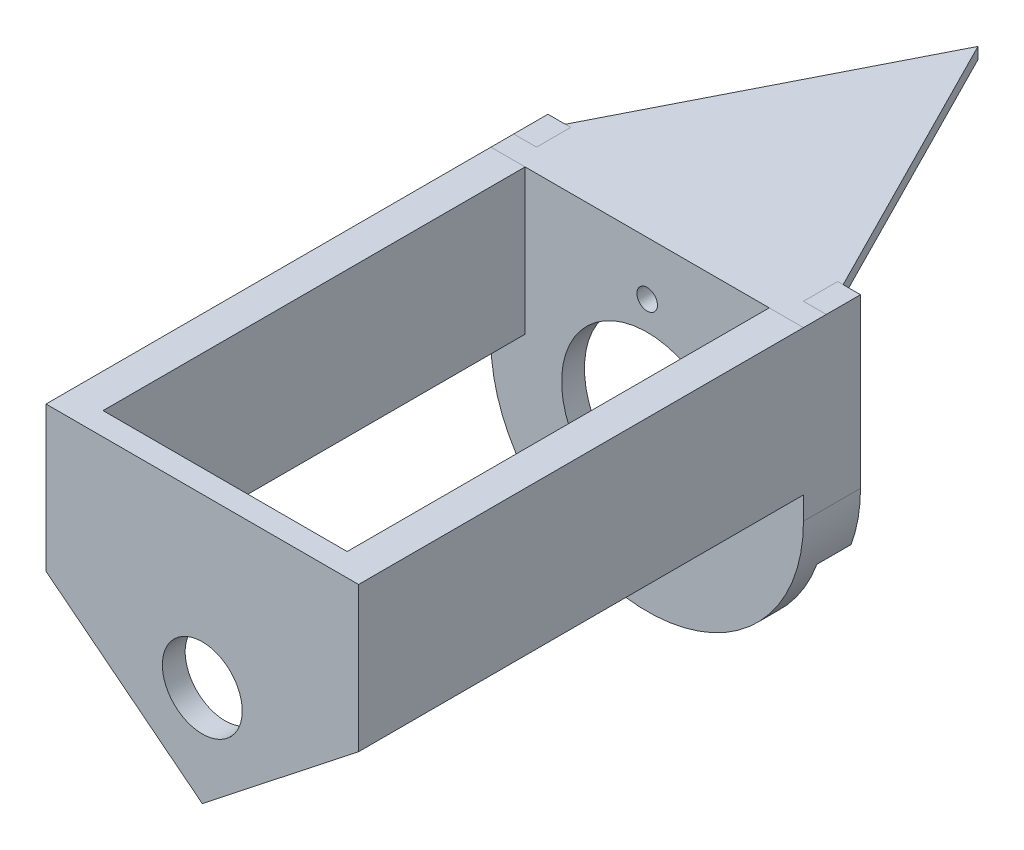
ISO-10303-21;
HEADER;
FILE_DESCRIPTION(('STEP AP214'),'2;1');
FILE_NAME('part.step','',(''),(''),'','','');
FILE_SCHEMA(('AUTOMOTIVE_DESIGN { 1 0 10303 214 1 1 1 1 }'));
ENDSEC;
DATA;
#1=APPLICATION_CONTEXT('core data for automotive mechanical design processes');
#2=APPLICATION_PROTOCOL_DEFINITION('international standard','automotive_design',2000,#1);
#3=PRODUCT_CONTEXT('',#1,'mechanical');
#4=PRODUCT('Part','Part','',(#3));
#5=PRODUCT_RELATED_PRODUCT_CATEGORY('part','',(#4));
#6=PRODUCT_DEFINITION_FORMATION('','',#4);
#7=PRODUCT_DEFINITION_CONTEXT('part definition',#1,'design');
#8=PRODUCT_DEFINITION('design','',#6,#7);
#9=PRODUCT_DEFINITION_SHAPE('','',#8);
#10=(LENGTH_UNIT() NAMED_UNIT(*) SI_UNIT(.MILLI.,.METRE.));
#11=(NAMED_UNIT(*) PLANE_ANGLE_UNIT() SI_UNIT($,.RADIAN.));
#12=(NAMED_UNIT(*) SI_UNIT($,.STERADIAN.) SOLID_ANGLE_UNIT());
#13=UNCERTAINTY_MEASURE_WITH_UNIT(LENGTH_MEASURE(1.E-05),#10,'distance_accuracy_value','');
#14=(GEOMETRIC_REPRESENTATION_CONTEXT(3) GLOBAL_UNCERTAINTY_ASSIGNED_CONTEXT((#13)) GLOBAL_UNIT_ASSIGNED_CONTEXT((#10,
#11,#12)) REPRESENTATION_CONTEXT('',''));
#15=CARTESIAN_POINT('',(0.,0.,0.));
#16=DIRECTION('',(0.,0.,1.));
#17=DIRECTION('',(1.,0.,0.));
#18=AXIS2_PLACEMENT_3D('',#15,#16,#17);
#19=CARTESIAN_POINT('',(0.,0.,0.));
#20=DIRECTION('',(0.,0.,1.));
#21=DIRECTION('',(1.,0.,0.));
#22=AXIS2_PLACEMENT_3D('',#19,#20,#21);
#23=PLANE('',#22);
#24=CARTESIAN_POINT('',(0.,-10.,0.));
#25=DIRECTION('',(0.,0.,1.));
#26=DIRECTION('',(1.,0.,0.));
#27=AXIS2_PLACEMENT_3D('',#24,#25,#26);
#28=CIRCLE('',#27,0.9);
#29=CARTESIAN_POINT('',(0.9,-10.,0.));
#30=VERTEX_POINT('',#29);
#31=EDGE_CURVE('E349',#30,#30,#28,.F.);
#32=ORIENTED_EDGE('',*,*,#31,.F.);
#33=EDGE_LOOP('',(#32));
#34=FACE_BOUND('',#33,.T.);
#35=CARTESIAN_POINT('',(0.,10.,0.));
#36=DIRECTION('',(0.,0.,1.));
#37=DIRECTION('',(1.,0.,0.));
#38=AXIS2_PLACEMENT_3D('',#35,#36,#37);
#39=CIRCLE('',#38,0.9);
#40=CARTESIAN_POINT('',(0.9,10.,0.));
#41=VERTEX_POINT('',#40);
#42=EDGE_CURVE('E358',#41,#41,#39,.F.);
#43=ORIENTED_EDGE('',*,*,#42,.F.);
#44=EDGE_LOOP('',(#43));
#45=FACE_BOUND('',#44,.T.);
#46=CARTESIAN_POINT('',(0.,0.,0.));
#47=DIRECTION('',(0.,0.,1.));
#48=DIRECTION('',(1.,0.,0.));
#49=AXIS2_PLACEMENT_3D('',#46,#47,#48);
#50=CIRCLE('',#49,7.5);
#51=CARTESIAN_POINT('',(7.5,0.,0.));
#52=VERTEX_POINT('',#51);
#53=EDGE_CURVE('E432',#52,#52,#50,.F.);
#54=ORIENTED_EDGE('',*,*,#53,.F.);
#55=EDGE_LOOP('',(#54));
#56=FACE_BOUND('',#55,.T.);
#57=DIRECTION('',(0.,-1.,0.));
#58=VECTOR('',#57,1.);
#59=CARTESIAN_POINT('',(-11.7,14.700025,0.));
#60=LINE('',#59,#58);
#61=CARTESIAN_POINT('',(-11.7,13.7,0.));
#62=VERTEX_POINT('',#61);
#63=CARTESIAN_POINT('',(-11.7,0.,0.));
#64=VERTEX_POINT('',#63);
#65=EDGE_CURVE('E272',#62,#64,#60,.T.);
#66=ORIENTED_EDGE('',*,*,#65,.F.);
#67=DIRECTION('',(1.,0.,0.));
#68=VECTOR('',#67,1.);
#69=CARTESIAN_POINT('',(0.,13.7,0.));
#70=LINE('',#69,#68);
#71=CARTESIAN_POINT('',(11.7,13.7,0.));
#72=VERTEX_POINT('',#71);
#73=EDGE_CURVE('E475',#62,#72,#70,.T.);
#74=ORIENTED_EDGE('',*,*,#73,.T.);
#75=DIRECTION('',(0.,-1.,0.));
#76=VECTOR('',#75,1.);
#77=CARTESIAN_POINT('',(11.7,14.700025,0.));
#78=LINE('',#77,#76);
#79=CARTESIAN_POINT('',(11.7,0.,0.));
#80=VERTEX_POINT('',#79);
#81=EDGE_CURVE('E302',#72,#80,#78,.T.);
#82=ORIENTED_EDGE('',*,*,#81,.T.);
#83=CARTESIAN_POINT('',(0.,0.,0.));
#84=DIRECTION('',(0.,0.,-1.));
#85=DIRECTION('',(-1.,0.,0.));
#86=AXIS2_PLACEMENT_3D('',#83,#84,#85);
#87=CIRCLE('',#86,11.7);
#88=CARTESIAN_POINT('',(10.9944036631951,-4.00163567691034,0.));
#89=VERTEX_POINT('',#88);
#90=EDGE_CURVE('E458',#80,#89,#87,.T.);
#91=ORIENTED_EDGE('',*,*,#90,.T.);
#92=DIRECTION('',(-0.939692620785908,0.34202014332567,0.));
#93=VECTOR('',#92,1.);
#94=CARTESIAN_POINT('',(0.,0.,0.));
#95=LINE('',#94,#93);
#96=CARTESIAN_POINT('',(12.8737889047669,-4.68567596356168,0.));
#97=VERTEX_POINT('',#96);
#98=EDGE_CURVE('E454',#97,#89,#95,.T.);
#99=ORIENTED_EDGE('',*,*,#98,.F.);
#100=CARTESIAN_POINT('',(0.,0.,0.));
#101=DIRECTION('',(0.,0.,1.));
#102=DIRECTION('',(1.,0.,0.));
#103=AXIS2_PLACEMENT_3D('',#100,#101,#102);
#104=CIRCLE('',#103,13.7);
#105=CARTESIAN_POINT('',(-12.8737889047669,-4.68567596356167,0.));
#106=VERTEX_POINT('',#105);
#107=EDGE_CURVE('E486',#106,#97,#104,.T.);
#108=ORIENTED_EDGE('',*,*,#107,.F.);
#109=DIRECTION('',(-0.939692620785908,-0.342020143325669,0.));
#110=VECTOR('',#109,1.);
#111=CARTESIAN_POINT('',(0.,0.,0.));
#112=LINE('',#111,#110);
#113=CARTESIAN_POINT('',(-10.9944036631951,-4.00163567691033,0.));
#114=VERTEX_POINT('',#113);
#115=EDGE_CURVE('E439',#114,#106,#112,.T.);
#116=ORIENTED_EDGE('',*,*,#115,.F.);
#117=CARTESIAN_POINT('',(0.,0.,0.));
#118=DIRECTION('',(0.,0.,-1.));
#119=DIRECTION('',(-1.,0.,0.));
#120=AXIS2_PLACEMENT_3D('',#117,#118,#119);
#121=CIRCLE('',#120,11.7);
#122=EDGE_CURVE('E435',#114,#64,#121,.T.);
#123=ORIENTED_EDGE('',*,*,#122,.T.);
#124=EDGE_LOOP('',(#66,#74,#82,#91,#99,#108,#116,#123));
#125=FACE_BOUND('',#124,.T.);
#126=ADVANCED_FACE('F35',(#34,#45,#56,#125),#23,.F.);
#127=CARTESIAN_POINT('',(0.,14.7,0.));
#128=DIRECTION('',(0.,1.,0.));
#129=DIRECTION('',(0.,0.,1.));
#130=AXIS2_PLACEMENT_3D('',#127,#128,#129);
#131=PLANE('',#130);
#132=DIRECTION('',(0.,0.,1.));
#133=VECTOR('',#132,1.);
#134=CARTESIAN_POINT('',(-11.7,14.7,0.));
#135=LINE('',#134,#133);
#136=CARTESIAN_POINT('',(-11.7,14.7,-3.));
#137=VERTEX_POINT('',#136);
#138=CARTESIAN_POINT('',(-11.7,14.7,0.));
#139=VERTEX_POINT('',#138);
#140=EDGE_CURVE('E50',#137,#139,#135,.T.);
#141=ORIENTED_EDGE('',*,*,#140,.T.);
#142=DIRECTION('',(-1.,0.,0.));
#143=VECTOR('',#142,1.);
#144=CARTESIAN_POINT('',(0.,14.7,0.));
#145=LINE('',#144,#143);
#146=CARTESIAN_POINT('',(-13.7,14.7,0.));
#147=VERTEX_POINT('',#146);
#148=EDGE_CURVE('E277',#139,#147,#145,.T.);
#149=ORIENTED_EDGE('',*,*,#148,.T.);
#150=DIRECTION('',(0.,0.,1.));
#151=VECTOR('',#150,1.);
#152=CARTESIAN_POINT('',(-13.7,14.7,0.));
#153=LINE('',#152,#151);
#154=CARTESIAN_POINT('',(-13.7,14.7,2.));
#155=VERTEX_POINT('',#154);
#156=EDGE_CURVE('E267',#147,#155,#153,.T.);
#157=ORIENTED_EDGE('',*,*,#156,.T.);
#158=DIRECTION('',(1.,0.,0.));
#159=VECTOR('',#158,1.);
#160=CARTESIAN_POINT('',(0.,14.7,2.));
#161=LINE('',#160,#159);
#162=CARTESIAN_POINT('',(-10.7,14.7,2.));
#163=VERTEX_POINT('',#162);
#164=EDGE_CURVE('E417',#155,#163,#161,.T.);
#165=ORIENTED_EDGE('',*,*,#164,.T.);
#166=CARTESIAN_POINT('',(10.7,14.7,2.));
#167=VERTEX_POINT('',#166);
#168=EDGE_CURVE('E416',#163,#167,#161,.T.);
#169=ORIENTED_EDGE('',*,*,#168,.T.);
#170=DIRECTION('',(1.,0.,0.));
#171=VECTOR('',#170,1.);
#172=CARTESIAN_POINT('',(0.,14.7,2.));
#173=LINE('',#172,#171);
#174=CARTESIAN_POINT('',(13.7,14.7,2.));
#175=VERTEX_POINT('',#174);
#176=EDGE_CURVE('E346',#167,#175,#173,.T.);
#177=ORIENTED_EDGE('',*,*,#176,.T.);
#178=DIRECTION('',(0.,0.,-1.));
#179=VECTOR('',#178,1.);
#180=CARTESIAN_POINT('',(13.7,14.7,0.));
#181=LINE('',#180,#179);
#182=CARTESIAN_POINT('',(13.7,14.7,0.));
#183=VERTEX_POINT('',#182);
#184=EDGE_CURVE('E420',#175,#183,#181,.T.);
#185=ORIENTED_EDGE('',*,*,#184,.T.);
#186=DIRECTION('',(-1.,0.,0.));
#187=VECTOR('',#186,1.);
#188=CARTESIAN_POINT('',(0.,14.7,0.));
#189=LINE('',#188,#187);
#190=CARTESIAN_POINT('',(11.7,14.7,0.));
#191=VERTEX_POINT('',#190);
#192=EDGE_CURVE('E311',#183,#191,#189,.T.);
#193=ORIENTED_EDGE('',*,*,#192,.T.);
#194=DIRECTION('',(0.,0.,-1.));
#195=VECTOR('',#194,1.);
#196=CARTESIAN_POINT('',(11.7,14.7,0.));
#197=LINE('',#196,#195);
#198=CARTESIAN_POINT('',(11.7,14.7,-3.));
#199=VERTEX_POINT('',#198);
#200=EDGE_CURVE('E313',#191,#199,#197,.T.);
#201=ORIENTED_EDGE('',*,*,#200,.T.);
#202=DIRECTION('',(1.,0.,0.));
#203=VECTOR('',#202,1.);
#204=CARTESIAN_POINT('',(0.,14.7,-3.));
#205=LINE('',#204,#203);
#206=CARTESIAN_POINT('',(12.1777777777778,14.7,-3.));
#207=VERTEX_POINT('',#206);
#208=EDGE_CURVE('E309',#199,#207,#205,.T.);
#209=ORIENTED_EDGE('',*,*,#208,.T.);
#210=DIRECTION('',(-0.45249034853551,0.,-0.891769300033486));
#211=VECTOR('',#210,1.);
#212=CARTESIAN_POINT('',(10.8949590374063,14.7,-5.52818291898024));
#213=LINE('',#212,#211);
#214=CARTESIAN_POINT('',(0.,14.7,-27.));
#215=VERTEX_POINT('',#214);
#216=EDGE_CURVE('E422',#207,#215,#213,.T.);
#217=ORIENTED_EDGE('',*,*,#216,.T.);
#218=DIRECTION('',(-0.45249034853551,0.,0.891769300033486));
#219=VECTOR('',#218,1.);
#220=CARTESIAN_POINT('',(-10.8949590374063,14.7,-5.52818291898024));
#221=LINE('',#220,#219);
#222=CARTESIAN_POINT('',(-12.1777777777778,14.7,-3.));
#223=VERTEX_POINT('',#222);
#224=EDGE_CURVE('E412',#215,#223,#221,.T.);
#225=ORIENTED_EDGE('',*,*,#224,.T.);
#226=DIRECTION('',(1.,0.,0.));
#227=VECTOR('',#226,1.);
#228=CARTESIAN_POINT('',(0.,14.7,-3.));
#229=LINE('',#228,#227);
#230=EDGE_CURVE('E55',#223,#137,#229,.T.);
#231=ORIENTED_EDGE('',*,*,#230,.T.);
#232=EDGE_LOOP('',(#141,#149,#157,#165,#169,#177,#185,#193,#201,#209,#217,#225,#231));
#233=FACE_BOUND('',#232,.T.);
#234=ADVANCED_FACE('F615',(#233),#131,.T.);
#235=CARTESIAN_POINT('',(0.,13.7,0.));
#236=DIRECTION('',(0.,1.,0.));
#237=DIRECTION('',(0.,0.,1.));
#238=AXIS2_PLACEMENT_3D('',#235,#236,#237);
#239=PLANE('',#238);
#240=DIRECTION('',(0.,0.,1.));
#241=VECTOR('',#240,1.);
#242=CARTESIAN_POINT('',(-11.7,13.7,0.));
#243=LINE('',#242,#241);
#244=CARTESIAN_POINT('',(-11.7,13.7,-3.));
#245=VERTEX_POINT('',#244);
#246=EDGE_CURVE('E279',#245,#62,#243,.T.);
#247=ORIENTED_EDGE('',*,*,#246,.F.);
#248=DIRECTION('',(1.,0.,0.));
#249=VECTOR('',#248,1.);
#250=CARTESIAN_POINT('',(0.,13.7,-3.));
#251=LINE('',#250,#249);
#252=CARTESIAN_POINT('',(-12.1777777777778,13.7,-3.));
#253=VERTEX_POINT('',#252);
#254=EDGE_CURVE('E268',#253,#245,#251,.T.);
#255=ORIENTED_EDGE('',*,*,#254,.F.);
#256=DIRECTION('',(-0.45249034853551,0.,0.891769300033486));
#257=VECTOR('',#256,1.);
#258=CARTESIAN_POINT('',(-10.8949590374063,13.7,-5.52818291898024));
#259=LINE('',#258,#257);
#260=CARTESIAN_POINT('',(0.,13.7,-27.));
#261=VERTEX_POINT('',#260);
#262=EDGE_CURVE('E410',#261,#253,#259,.T.);
#263=ORIENTED_EDGE('',*,*,#262,.F.);
#264=DIRECTION('',(-0.45249034853551,0.,-0.891769300033486));
#265=VECTOR('',#264,1.);
#266=CARTESIAN_POINT('',(10.8949590374063,13.7,-5.52818291898024));
#267=LINE('',#266,#265);
#268=CARTESIAN_POINT('',(12.1777777777778,13.7,-3.));
#269=VERTEX_POINT('',#268);
#270=EDGE_CURVE('E414',#269,#261,#267,.T.);
#271=ORIENTED_EDGE('',*,*,#270,.F.);
#272=DIRECTION('',(1.,0.,0.));
#273=VECTOR('',#272,1.);
#274=CARTESIAN_POINT('',(0.,13.7,-3.));
#275=LINE('',#274,#273);
#276=CARTESIAN_POINT('',(11.7,13.7,-3.));
#277=VERTEX_POINT('',#276);
#278=EDGE_CURVE('E498',#277,#269,#275,.T.);
#279=ORIENTED_EDGE('',*,*,#278,.F.);
#280=DIRECTION('',(0.,0.,-1.));
#281=VECTOR('',#280,1.);
#282=CARTESIAN_POINT('',(11.7,13.7,0.));
#283=LINE('',#282,#281);
#284=EDGE_CURVE('E43',#72,#277,#283,.T.);
#285=ORIENTED_EDGE('',*,*,#284,.F.);
#286=ORIENTED_EDGE('',*,*,#73,.F.);
#287=EDGE_LOOP('',(#247,#255,#263,#271,#279,#285,#286));
#288=FACE_BOUND('',#287,.T.);
#289=ADVANCED_FACE('F637',(#288),#239,.F.);
#290=CARTESIAN_POINT('',(-10.8949590374063,14.7,-5.52818291898024));
#291=DIRECTION('',(0.891769300033486,0.,0.452490348535509));
#292=DIRECTION('',(0.45249034853551,0.,-0.891769300033486));
#293=AXIS2_PLACEMENT_3D('',#290,#291,#292);
#294=PLANE('',#293);
#295=DIRECTION('',(0.,-1.,0.));
#296=VECTOR('',#295,1.);
#297=CARTESIAN_POINT('',(-12.1777777777778,14.7,-3.));
#298=LINE('',#297,#296);
#299=EDGE_CURVE('E11',#223,#253,#298,.T.);
#300=ORIENTED_EDGE('',*,*,#299,.F.);
#301=ORIENTED_EDGE('',*,*,#224,.F.);
#302=DIRECTION('',(0.,-1.,0.));
#303=VECTOR('',#302,1.);
#304=CARTESIAN_POINT('',(0.,14.7,-27.));
#305=LINE('',#304,#303);
#306=EDGE_CURVE('E424',#215,#261,#305,.T.);
#307=ORIENTED_EDGE('',*,*,#306,.T.);
#308=ORIENTED_EDGE('',*,*,#262,.T.);
#309=EDGE_LOOP('',(#300,#301,#307,#308));
#310=FACE_BOUND('',#309,.T.);
#311=ADVANCED_FACE('F882',(#310),#294,.F.);
#312=CARTESIAN_POINT('',(10.8949590374063,14.7,-5.52818291898024));
#313=DIRECTION('',(-0.891769300033486,0.,0.452490348535509));
#314=DIRECTION('',(0.45249034853551,0.,0.891769300033486));
#315=AXIS2_PLACEMENT_3D('',#312,#313,#314);
#316=PLANE('',#315);
#317=DIRECTION('',(0.,1.,0.));
#318=VECTOR('',#317,1.);
#319=CARTESIAN_POINT('',(12.1777777777778,14.7,-3.));
#320=LINE('',#319,#318);
#321=EDGE_CURVE('E306',#269,#207,#320,.T.);
#322=ORIENTED_EDGE('',*,*,#321,.F.);
#323=ORIENTED_EDGE('',*,*,#270,.T.);
#324=ORIENTED_EDGE('',*,*,#306,.F.);
#325=ORIENTED_EDGE('',*,*,#216,.F.);
#326=EDGE_LOOP('',(#322,#323,#324,#325));
#327=FACE_BOUND('',#326,.T.);
#328=ADVANCED_FACE('F893',(#327),#316,.F.);
#329=CARTESIAN_POINT('',(0.,0.,2.));
#330=DIRECTION('',(0.,0.,1.));
#331=DIRECTION('',(1.,0.,0.));
#332=AXIS2_PLACEMENT_3D('',#329,#330,#331);
#333=PLANE('',#332);
#334=CARTESIAN_POINT('',(0.,-10.,2.));
#335=DIRECTION('',(0.,0.,1.));
#336=DIRECTION('',(1.,0.,0.));
#337=AXIS2_PLACEMENT_3D('',#334,#335,#336);
#338=CIRCLE('',#337,0.9);
#339=CARTESIAN_POINT('',(0.9,-10.,2.));
#340=VERTEX_POINT('',#339);
#341=EDGE_CURVE('E352',#340,#340,#338,.T.);
#342=ORIENTED_EDGE('',*,*,#341,.F.);
#343=EDGE_LOOP('',(#342));
#344=FACE_BOUND('',#343,.T.);
#345=CARTESIAN_POINT('',(0.,10.,2.));
#346=DIRECTION('',(0.,0.,1.));
#347=DIRECTION('',(1.,0.,0.));
#348=AXIS2_PLACEMENT_3D('',#345,#346,#347);
#349=CIRCLE('',#348,0.9);
#350=CARTESIAN_POINT('',(0.9,10.,2.));
#351=VERTEX_POINT('',#350);
#352=EDGE_CURVE('E355',#351,#351,#349,.T.);
#353=ORIENTED_EDGE('',*,*,#352,.F.);
#354=EDGE_LOOP('',(#353));
#355=FACE_BOUND('',#354,.T.);
#356=CARTESIAN_POINT('',(0.,0.,2.));
#357=DIRECTION('',(0.,0.,1.));
#358=DIRECTION('',(1.,0.,0.));
#359=AXIS2_PLACEMENT_3D('',#356,#357,#358);
#360=CIRCLE('',#359,7.5);
#361=CARTESIAN_POINT('',(7.5,0.,2.));
#362=VERTEX_POINT('',#361);
#363=EDGE_CURVE('E429',#362,#362,#360,.T.);
#364=ORIENTED_EDGE('',*,*,#363,.F.);
#365=EDGE_LOOP('',(#364));
#366=FACE_BOUND('',#365,.T.);
#367=ORIENTED_EDGE('',*,*,#168,.F.);
#368=DIRECTION('',(0.,1.,0.));
#369=VECTOR('',#368,1.);
#370=CARTESIAN_POINT('',(-10.7,0.,2.));
#371=LINE('',#370,#369);
#372=CARTESIAN_POINT('',(-10.7,2.,2.));
#373=VERTEX_POINT('',#372);
#374=EDGE_CURVE('E406',#373,#163,#371,.T.);
#375=ORIENTED_EDGE('',*,*,#374,.F.);
#376=DIRECTION('',(-1.,0.,0.));
#377=VECTOR('',#376,1.);
#378=CARTESIAN_POINT('',(0.,2.,2.));
#379=LINE('',#378,#377);
#380=CARTESIAN_POINT('',(-13.7,2.,2.));
#381=VERTEX_POINT('',#380);
#382=EDGE_CURVE('E401',#373,#381,#379,.T.);
#383=ORIENTED_EDGE('',*,*,#382,.T.);
#384=DIRECTION('',(0.,-1.,0.));
#385=VECTOR('',#384,1.);
#386=CARTESIAN_POINT('',(-13.7,0.,2.));
#387=LINE('',#386,#385);
#388=CARTESIAN_POINT('',(-13.7,0.,2.));
#389=VERTEX_POINT('',#388);
#390=EDGE_CURVE('E477',#381,#389,#387,.T.);
#391=ORIENTED_EDGE('',*,*,#390,.T.);
#392=CARTESIAN_POINT('',(0.,0.,2.));
#393=DIRECTION('',(0.,0.,1.));
#394=DIRECTION('',(1.,0.,0.));
#395=AXIS2_PLACEMENT_3D('',#392,#393,#394);
#396=CIRCLE('',#395,13.7);
#397=CARTESIAN_POINT('',(13.7,0.,2.));
#398=VERTEX_POINT('',#397);
#399=EDGE_CURVE('E471',#389,#398,#396,.T.);
#400=ORIENTED_EDGE('',*,*,#399,.T.);
#401=DIRECTION('',(0.,-1.,0.));
#402=VECTOR('',#401,1.);
#403=CARTESIAN_POINT('',(13.7,0.,2.));
#404=LINE('',#403,#402);
#405=CARTESIAN_POINT('',(13.7,2.,2.));
#406=VERTEX_POINT('',#405);
#407=EDGE_CURVE('E474',#406,#398,#404,.T.);
#408=ORIENTED_EDGE('',*,*,#407,.F.);
#409=DIRECTION('',(-1.,0.,0.));
#410=VECTOR('',#409,1.);
#411=CARTESIAN_POINT('',(0.,2.,2.));
#412=LINE('',#411,#410);
#413=CARTESIAN_POINT('',(10.7,2.,2.));
#414=VERTEX_POINT('',#413);
#415=EDGE_CURVE('E388',#406,#414,#412,.T.);
#416=ORIENTED_EDGE('',*,*,#415,.T.);
#417=DIRECTION('',(0.,1.,0.));
#418=VECTOR('',#417,1.);
#419=CARTESIAN_POINT('',(10.7,0.,2.));
#420=LINE('',#419,#418);
#421=EDGE_CURVE('E392',#414,#167,#420,.T.);
#422=ORIENTED_EDGE('',*,*,#421,.T.);
#423=EDGE_LOOP('',(#367,#375,#383,#391,#400,#408,#416,#422));
#424=FACE_BOUND('',#423,.T.);
#425=ADVANCED_FACE('F571',(#344,#355,#366,#424),#333,.T.);
#426=CARTESIAN_POINT('',(0.,2.,41.));
#427=DIRECTION('',(0.,-1.,0.));
#428=DIRECTION('',(1.,0.,0.));
#429=AXIS2_PLACEMENT_3D('',#426,#427,#428);
#430=PLANE('',#429);
#431=DIRECTION('',(0.,0.,-1.));
#432=VECTOR('',#431,1.);
#433=CARTESIAN_POINT('',(-10.7,2.,41.));
#434=LINE('',#433,#432);
#435=CARTESIAN_POINT('',(-10.7,2.,39.));
#436=VERTEX_POINT('',#435);
#437=EDGE_CURVE('E408',#436,#373,#434,.T.);
#438=ORIENTED_EDGE('',*,*,#437,.F.);
#439=DIRECTION('',(1.,0.,0.));
#440=VECTOR('',#439,1.);
#441=CARTESIAN_POINT('',(0.,2.,39.));
#442=LINE('',#441,#440);
#443=CARTESIAN_POINT('',(-13.7,2.,39.));
#444=VERTEX_POINT('',#443);
#445=EDGE_CURVE('E381',#444,#436,#442,.T.);
#446=ORIENTED_EDGE('',*,*,#445,.F.);
#447=DIRECTION('',(0.,0.,-1.));
#448=VECTOR('',#447,1.);
#449=CARTESIAN_POINT('',(-13.7,2.,41.));
#450=LINE('',#449,#448);
#451=EDGE_CURVE('E405',#444,#381,#450,.T.);
#452=ORIENTED_EDGE('',*,*,#451,.T.);
#453=ORIENTED_EDGE('',*,*,#382,.F.);
#454=EDGE_LOOP('',(#438,#446,#452,#453));
#455=FACE_BOUND('',#454,.T.);
#456=ADVANCED_FACE('F576',(#455),#430,.T.);
#457=CARTESIAN_POINT('',(-10.7,0.,41.));
#458=DIRECTION('',(-1.,0.,0.));
#459=DIRECTION('',(0.,0.,1.));
#460=AXIS2_PLACEMENT_3D('',#457,#458,#459);
#461=PLANE('',#460);
#462=DIRECTION('',(0.,1.,0.));
#463=VECTOR('',#462,1.);
#464=CARTESIAN_POINT('',(-10.7,0.,39.));
#465=LINE('',#464,#463);
#466=CARTESIAN_POINT('',(-10.7,14.700025,39.));
#467=VERTEX_POINT('',#466);
#468=EDGE_CURVE('E379',#436,#467,#465,.T.);
#469=ORIENTED_EDGE('',*,*,#468,.F.);
#470=ORIENTED_EDGE('',*,*,#437,.T.);
#471=ORIENTED_EDGE('',*,*,#374,.T.);
#472=DIRECTION('',(0.,-1.,0.));
#473=VECTOR('',#472,1.);
#474=CARTESIAN_POINT('',(-10.7,14.700025,2.));
#475=LINE('',#474,#473);
#476=CARTESIAN_POINT('',(-10.7,14.700025,2.));
#477=VERTEX_POINT('',#476);
#478=EDGE_CURVE('E343',#477,#163,#475,.T.);
#479=ORIENTED_EDGE('',*,*,#478,.F.);
#480=DIRECTION('',(0.,0.,-1.));
#481=VECTOR('',#480,1.);
#482=CARTESIAN_POINT('',(-10.7,14.700025,39.));
#483=LINE('',#482,#481);
#484=EDGE_CURVE('E315',#467,#477,#483,.T.);
#485=ORIENTED_EDGE('',*,*,#484,.F.);
#486=EDGE_LOOP('',(#469,#470,#471,#479,#485));
#487=FACE_BOUND('',#486,.T.);
#488=ADVANCED_FACE('F610',(#487),#461,.F.);
#489=CARTESIAN_POINT('',(0.,2.,41.));
#490=DIRECTION('',(0.,-1.,0.));
#491=DIRECTION('',(1.,0.,0.));
#492=AXIS2_PLACEMENT_3D('',#489,#490,#491);
#493=PLANE('',#492);
#494=DIRECTION('',(0.,0.,-1.));
#495=VECTOR('',#494,1.);
#496=CARTESIAN_POINT('',(13.7,2.,41.));
#497=LINE('',#496,#495);
#498=CARTESIAN_POINT('',(13.7,2.,39.));
#499=VERTEX_POINT('',#498);
#500=EDGE_CURVE('E397',#499,#406,#497,.T.);
#501=ORIENTED_EDGE('',*,*,#500,.F.);
#502=DIRECTION('',(1.,0.,0.));
#503=VECTOR('',#502,1.);
#504=CARTESIAN_POINT('',(0.,2.,39.));
#505=LINE('',#504,#503);
#506=CARTESIAN_POINT('',(10.7,2.,39.));
#507=VERTEX_POINT('',#506);
#508=EDGE_CURVE('E373',#507,#499,#505,.T.);
#509=ORIENTED_EDGE('',*,*,#508,.F.);
#510=DIRECTION('',(0.,0.,-1.));
#511=VECTOR('',#510,1.);
#512=CARTESIAN_POINT('',(10.7,2.,41.));
#513=LINE('',#512,#511);
#514=EDGE_CURVE('E391',#507,#414,#513,.T.);
#515=ORIENTED_EDGE('',*,*,#514,.T.);
#516=ORIENTED_EDGE('',*,*,#415,.F.);
#517=EDGE_LOOP('',(#501,#509,#515,#516));
#518=FACE_BOUND('',#517,.T.);
#519=ADVANCED_FACE('F622',(#518),#493,.T.);
#520=CARTESIAN_POINT('',(10.7,0.,41.));
#521=DIRECTION('',(-1.,0.,0.));
#522=DIRECTION('',(0.,0.,1.));
#523=AXIS2_PLACEMENT_3D('',#520,#521,#522);
#524=PLANE('',#523);
#525=ORIENTED_EDGE('',*,*,#514,.F.);
#526=DIRECTION('',(0.,-1.,0.));
#527=VECTOR('',#526,1.);
#528=CARTESIAN_POINT('',(10.7,0.,39.));
#529=LINE('',#528,#527);
#530=CARTESIAN_POINT('',(10.7,14.700025,39.));
#531=VERTEX_POINT('',#530);
#532=EDGE_CURVE('E376',#531,#507,#529,.T.);
#533=ORIENTED_EDGE('',*,*,#532,.F.);
#534=DIRECTION('',(0.,0.,1.));
#535=VECTOR('',#534,1.);
#536=CARTESIAN_POINT('',(10.7,14.700025,2.));
#537=LINE('',#536,#535);
#538=CARTESIAN_POINT('',(10.7,14.700025,2.));
#539=VERTEX_POINT('',#538);
#540=EDGE_CURVE('E330',#539,#531,#537,.T.);
#541=ORIENTED_EDGE('',*,*,#540,.F.);
#542=DIRECTION('',(0.,-1.,0.));
#543=VECTOR('',#542,1.);
#544=CARTESIAN_POINT('',(10.7,14.700025,2.));
#545=LINE('',#544,#543);
#546=EDGE_CURVE('E336',#539,#167,#545,.T.);
#547=ORIENTED_EDGE('',*,*,#546,.T.);
#548=ORIENTED_EDGE('',*,*,#421,.F.);
#549=EDGE_LOOP('',(#525,#533,#541,#547,#548));
#550=FACE_BOUND('',#549,.T.);
#551=ADVANCED_FACE('F620',(#550),#524,.T.);
#552=CARTESIAN_POINT('',(0.,0.,2.));
#553=DIRECTION('',(0.,0.,-1.));
#554=DIRECTION('',(-1.,0.,0.));
#555=AXIS2_PLACEMENT_3D('',#552,#553,#554);
#556=CYLINDRICAL_SURFACE('',#555,13.7);
#557=DIRECTION('',(0.,0.,-1.));
#558=VECTOR('',#557,1.);
#559=CARTESIAN_POINT('',(-13.7,0.,2.));
#560=LINE('',#559,#558);
#561=CARTESIAN_POINT('',(-13.7,0.,-3.));
#562=VERTEX_POINT('',#561);
#563=EDGE_CURVE('E485',#389,#562,#560,.T.);
#564=ORIENTED_EDGE('',*,*,#563,.T.);
#565=CARTESIAN_POINT('',(0.,0.,-3.));
#566=DIRECTION('',(0.,0.,-1.));
#567=DIRECTION('',(-1.,0.,0.));
#568=AXIS2_PLACEMENT_3D('',#565,#566,#567);
#569=CIRCLE('',#568,13.7);
#570=CARTESIAN_POINT('',(-12.8737889047669,-4.68567596356167,-3.));
#571=VERTEX_POINT('',#570);
#572=EDGE_CURVE('E441',#571,#562,#569,.T.);
#573=ORIENTED_EDGE('',*,*,#572,.F.);
#574=DIRECTION('',(0.,0.,1.));
#575=VECTOR('',#574,1.);
#576=CARTESIAN_POINT('',(-12.8737889047669,-4.68567596356167,-3.));
#577=LINE('',#576,#575);
#578=EDGE_CURVE('E444',#571,#106,#577,.T.);
#579=ORIENTED_EDGE('',*,*,#578,.T.);
#580=ORIENTED_EDGE('',*,*,#107,.T.);
#581=DIRECTION('',(0.,0.,1.));
#582=VECTOR('',#581,1.);
#583=CARTESIAN_POINT('',(12.8737889047669,-4.68567596356168,-3.));
#584=LINE('',#583,#582);
#585=CARTESIAN_POINT('',(12.8737889047669,-4.68567596356168,-3.));
#586=VERTEX_POINT('',#585);
#587=EDGE_CURVE('E470',#586,#97,#584,.T.);
#588=ORIENTED_EDGE('',*,*,#587,.F.);
#589=CARTESIAN_POINT('',(0.,0.,-3.));
#590=DIRECTION('',(0.,0.,-1.));
#591=DIRECTION('',(-1.,0.,0.));
#592=AXIS2_PLACEMENT_3D('',#589,#590,#591);
#593=CIRCLE('',#592,13.7);
#594=CARTESIAN_POINT('',(13.7,0.,-3.));
#595=VERTEX_POINT('',#594);
#596=EDGE_CURVE('E455',#595,#586,#593,.T.);
#597=ORIENTED_EDGE('',*,*,#596,.F.);
#598=DIRECTION('',(0.,0.,-1.));
#599=VECTOR('',#598,1.);
#600=CARTESIAN_POINT('',(13.7,0.,2.));
#601=LINE('',#600,#599);
#602=EDGE_CURVE('E500',#398,#595,#601,.T.);
#603=ORIENTED_EDGE('',*,*,#602,.F.);
#604=ORIENTED_EDGE('',*,*,#399,.F.);
#605=EDGE_LOOP('',(#564,#573,#579,#580,#588,#597,#603,#604));
#606=FACE_BOUND('',#605,.T.);
#607=ADVANCED_FACE('F37',(#606),#556,.T.);
#608=CARTESIAN_POINT('',(13.7,0.,2.));
#609=DIRECTION('',(1.,0.,0.));
#610=DIRECTION('',(0.,0.,-1.));
#611=AXIS2_PLACEMENT_3D('',#608,#609,#610);
#612=PLANE('',#611);
#613=ORIENTED_EDGE('',*,*,#602,.T.);
#614=DIRECTION('',(0.,-1.,0.));
#615=VECTOR('',#614,1.);
#616=CARTESIAN_POINT('',(13.7,14.700025,-3.));
#617=LINE('',#616,#615);
#618=CARTESIAN_POINT('',(13.7,14.700025,-3.));
#619=VERTEX_POINT('',#618);
#620=EDGE_CURVE('E296',#619,#595,#617,.T.);
#621=ORIENTED_EDGE('',*,*,#620,.F.);
#622=DIRECTION('',(0.,0.,-1.));
#623=VECTOR('',#622,1.);
#624=CARTESIAN_POINT('',(13.7,14.700025,0.));
#625=LINE('',#624,#623);
#626=CARTESIAN_POINT('',(13.7,14.700025,0.));
#627=VERTEX_POINT('',#626);
#628=EDGE_CURVE('E288',#627,#619,#625,.T.);
#629=ORIENTED_EDGE('',*,*,#628,.F.);
#630=DIRECTION('',(0.,-1.,0.));
#631=VECTOR('',#630,1.);
#632=CARTESIAN_POINT('',(13.7,14.700025,0.));
#633=LINE('',#632,#631);
#634=EDGE_CURVE('E299',#627,#183,#633,.T.);
#635=ORIENTED_EDGE('',*,*,#634,.T.);
#636=ORIENTED_EDGE('',*,*,#184,.F.);
#637=DIRECTION('',(0.,-1.,0.));
#638=VECTOR('',#637,1.);
#639=CARTESIAN_POINT('',(13.7,14.700025,2.));
#640=LINE('',#639,#638);
#641=CARTESIAN_POINT('',(13.7,14.700025,2.));
#642=VERTEX_POINT('',#641);
#643=EDGE_CURVE('E339',#642,#175,#640,.T.);
#644=ORIENTED_EDGE('',*,*,#643,.F.);
#645=DIRECTION('',(0.,0.,-1.));
#646=VECTOR('',#645,1.);
#647=CARTESIAN_POINT('',(13.7,14.700025,41.));
#648=LINE('',#647,#646);
#649=CARTESIAN_POINT('',(13.7,14.700025,41.));
#650=VERTEX_POINT('',#649);
#651=EDGE_CURVE('E326',#650,#642,#648,.T.);
#652=ORIENTED_EDGE('',*,*,#651,.F.);
#653=DIRECTION('',(0.,1.,0.));
#654=VECTOR('',#653,1.);
#655=CARTESIAN_POINT('',(13.7,0.,41.));
#656=LINE('',#655,#654);
#657=CARTESIAN_POINT('',(13.7,2.,41.));
#658=VERTEX_POINT('',#657);
#659=EDGE_CURVE('E389',#658,#650,#656,.T.);
#660=ORIENTED_EDGE('',*,*,#659,.F.);
#661=EDGE_CURVE('E398',#658,#499,#497,.T.);
#662=ORIENTED_EDGE('',*,*,#661,.T.);
#663=ORIENTED_EDGE('',*,*,#500,.T.);
#664=ORIENTED_EDGE('',*,*,#407,.T.);
#665=EDGE_LOOP('',(#613,#621,#629,#635,#636,#644,#652,#660,#662,#663,#664));
#666=FACE_BOUND('',#665,.T.);
#667=ADVANCED_FACE('F594',(#666),#612,.T.);
#668=CARTESIAN_POINT('',(-13.7,0.,2.));
#669=DIRECTION('',(1.,0.,0.));
#670=DIRECTION('',(0.,0.,-1.));
#671=AXIS2_PLACEMENT_3D('',#668,#669,#670);
#672=PLANE('',#671);
#673=DIRECTION('',(0.,-1.,0.));
#674=VECTOR('',#673,1.);
#675=CARTESIAN_POINT('',(-13.7,14.700025,-3.));
#676=LINE('',#675,#674);
#677=CARTESIAN_POINT('',(-13.7,14.700025,-3.));
#678=VERTEX_POINT('',#677);
#679=EDGE_CURVE('E557',#678,#562,#676,.T.);
#680=ORIENTED_EDGE('',*,*,#679,.T.);
#681=ORIENTED_EDGE('',*,*,#563,.F.);
#682=ORIENTED_EDGE('',*,*,#390,.F.);
#683=ORIENTED_EDGE('',*,*,#451,.F.);
#684=CARTESIAN_POINT('',(-13.7,2.,41.));
#685=VERTEX_POINT('',#684);
#686=EDGE_CURVE('E411',#685,#444,#450,.T.);
#687=ORIENTED_EDGE('',*,*,#686,.F.);
#688=DIRECTION('',(0.,-1.,0.));
#689=VECTOR('',#688,1.);
#690=CARTESIAN_POINT('',(-13.7,0.,41.));
#691=LINE('',#690,#689);
#692=CARTESIAN_POINT('',(-13.7,14.700025,41.));
#693=VERTEX_POINT('',#692);
#694=EDGE_CURVE('E402',#693,#685,#691,.T.);
#695=ORIENTED_EDGE('',*,*,#694,.F.);
#696=DIRECTION('',(0.,0.,1.));
#697=VECTOR('',#696,1.);
#698=CARTESIAN_POINT('',(-13.7,14.700025,2.));
#699=LINE('',#698,#697);
#700=CARTESIAN_POINT('',(-13.7,14.700025,2.));
#701=VERTEX_POINT('',#700);
#702=EDGE_CURVE('E320',#701,#693,#699,.T.);
#703=ORIENTED_EDGE('',*,*,#702,.F.);
#704=DIRECTION('',(0.,-1.,0.));
#705=VECTOR('',#704,1.);
#706=CARTESIAN_POINT('',(-13.7,14.700025,2.));
#707=LINE('',#706,#705);
#708=EDGE_CURVE('E341',#701,#155,#707,.T.);
#709=ORIENTED_EDGE('',*,*,#708,.T.);
#710=ORIENTED_EDGE('',*,*,#156,.F.);
#711=DIRECTION('',(0.,-1.,0.));
#712=VECTOR('',#711,1.);
#713=CARTESIAN_POINT('',(-13.7,14.700025,0.));
#714=LINE('',#713,#712);
#715=CARTESIAN_POINT('',(-13.7,14.700025,0.));
#716=VERTEX_POINT('',#715);
#717=EDGE_CURVE('E247',#716,#147,#714,.T.);
#718=ORIENTED_EDGE('',*,*,#717,.F.);
#719=DIRECTION('',(0.,0.,1.));
#720=VECTOR('',#719,1.);
#721=CARTESIAN_POINT('',(-13.7,14.700025,-3.));
#722=LINE('',#721,#720);
#723=EDGE_CURVE('E253',#678,#716,#722,.T.);
#724=ORIENTED_EDGE('',*,*,#723,.F.);
#725=EDGE_LOOP('',(#680,#681,#682,#683,#687,#695,#703,#709,#710,#718,#724));
#726=FACE_BOUND('',#725,.T.);
#727=ADVANCED_FACE('F264',(#726),#672,.F.);
#728=CARTESIAN_POINT('',(0.,0.,-3.));
#729=DIRECTION('',(0.34202014332567,0.939692620785908,0.));
#730=DIRECTION('',(-0.939692620785908,0.34202014332567,0.));
#731=AXIS2_PLACEMENT_3D('',#728,#729,#730);
#732=PLANE('',#731);
#733=ORIENTED_EDGE('',*,*,#98,.T.);
#734=DIRECTION('',(0.,0.,1.));
#735=VECTOR('',#734,1.);
#736=CARTESIAN_POINT('',(10.9944036631951,-4.00163567691034,-3.));
#737=LINE('',#736,#735);
#738=CARTESIAN_POINT('',(10.9944036631951,-4.00163567691034,-3.));
#739=VERTEX_POINT('',#738);
#740=EDGE_CURVE('E467',#739,#89,#737,.T.);
#741=ORIENTED_EDGE('',*,*,#740,.F.);
#742=DIRECTION('',(-0.939692620785908,0.34202014332567,0.));
#743=VECTOR('',#742,1.);
#744=CARTESIAN_POINT('',(0.,0.,-3.));
#745=LINE('',#744,#743);
#746=EDGE_CURVE('E457',#586,#739,#745,.T.);
#747=ORIENTED_EDGE('',*,*,#746,.F.);
#748=ORIENTED_EDGE('',*,*,#587,.T.);
#749=EDGE_LOOP('',(#733,#741,#747,#748));
#750=FACE_BOUND('',#749,.T.);
#751=ADVANCED_FACE('F533',(#750),#732,.F.);
#752=CARTESIAN_POINT('',(0.,0.,-3.));
#753=DIRECTION('',(0.,0.,1.));
#754=DIRECTION('',(1.,0.,0.));
#755=AXIS2_PLACEMENT_3D('',#752,#753,#754);
#756=CYLINDRICAL_SURFACE('',#755,11.7);
#757=ORIENTED_EDGE('',*,*,#90,.F.);
#758=DIRECTION('',(0.,0.,1.));
#759=VECTOR('',#758,1.);
#760=CARTESIAN_POINT('',(11.7,0.,-3.));
#761=LINE('',#760,#759);
#762=CARTESIAN_POINT('',(11.7,0.,-3.));
#763=VERTEX_POINT('',#762);
#764=EDGE_CURVE('E463',#763,#80,#761,.T.);
#765=ORIENTED_EDGE('',*,*,#764,.F.);
#766=CARTESIAN_POINT('',(0.,0.,-3.));
#767=DIRECTION('',(0.,0.,-1.));
#768=DIRECTION('',(-1.,0.,0.));
#769=AXIS2_PLACEMENT_3D('',#766,#767,#768);
#770=CIRCLE('',#769,11.7);
#771=EDGE_CURVE('E460',#763,#739,#770,.T.);
#772=ORIENTED_EDGE('',*,*,#771,.T.);
#773=ORIENTED_EDGE('',*,*,#740,.T.);
#774=EDGE_LOOP('',(#757,#765,#772,#773));
#775=FACE_BOUND('',#774,.T.);
#776=ADVANCED_FACE('F517',(#775),#756,.F.);
#777=CARTESIAN_POINT('',(0.,0.,-3.));
#778=DIRECTION('',(0.,0.,-1.));
#779=DIRECTION('',(-1.,0.,0.));
#780=AXIS2_PLACEMENT_3D('',#777,#778,#779);
#781=PLANE('',#780);
#782=ORIENTED_EDGE('',*,*,#771,.F.);
#783=DIRECTION('',(0.,-1.,0.));
#784=VECTOR('',#783,1.);
#785=CARTESIAN_POINT('',(11.7,14.700025,-3.));
#786=LINE('',#785,#784);
#787=EDGE_CURVE('E292',#277,#763,#786,.T.);
#788=ORIENTED_EDGE('',*,*,#787,.F.);
#789=ORIENTED_EDGE('',*,*,#278,.T.);
#790=ORIENTED_EDGE('',*,*,#321,.T.);
#791=ORIENTED_EDGE('',*,*,#208,.F.);
#792=CARTESIAN_POINT('',(11.7,14.700025,-3.));
#793=VERTEX_POINT('',#792);
#794=EDGE_CURVE('E293',#793,#199,#786,.T.);
#795=ORIENTED_EDGE('',*,*,#794,.F.);
#796=DIRECTION('',(-1.,0.,0.));
#797=VECTOR('',#796,1.);
#798=CARTESIAN_POINT('',(13.7,14.700025,-3.));
#799=LINE('',#798,#797);
#800=EDGE_CURVE('E290',#619,#793,#799,.T.);
#801=ORIENTED_EDGE('',*,*,#800,.F.);
#802=ORIENTED_EDGE('',*,*,#620,.T.);
#803=ORIENTED_EDGE('',*,*,#596,.T.);
#804=ORIENTED_EDGE('',*,*,#746,.T.);
#805=EDGE_LOOP('',(#782,#788,#789,#790,#791,#795,#801,#802,#803,#804));
#806=FACE_BOUND('',#805,.T.);
#807=ADVANCED_FACE('F512',(#806),#781,.T.);
#808=CARTESIAN_POINT('',(0.,0.,-3.));
#809=DIRECTION('',(0.,0.,1.));
#810=DIRECTION('',(1.,0.,0.));
#811=AXIS2_PLACEMENT_3D('',#808,#809,#810);
#812=CYLINDRICAL_SURFACE('',#811,11.7);
#813=ORIENTED_EDGE('',*,*,#122,.F.);
#814=DIRECTION('',(0.,0.,1.));
#815=VECTOR('',#814,1.);
#816=CARTESIAN_POINT('',(-10.9944036631951,-4.00163567691033,-3.));
#817=LINE('',#816,#815);
#818=CARTESIAN_POINT('',(-10.9944036631951,-4.00163567691033,-3.));
#819=VERTEX_POINT('',#818);
#820=EDGE_CURVE('E450',#819,#114,#817,.T.);
#821=ORIENTED_EDGE('',*,*,#820,.F.);
#822=CARTESIAN_POINT('',(0.,0.,-3.));
#823=DIRECTION('',(0.,0.,-1.));
#824=DIRECTION('',(-1.,0.,0.));
#825=AXIS2_PLACEMENT_3D('',#822,#823,#824);
#826=CIRCLE('',#825,11.7);
#827=CARTESIAN_POINT('',(-11.7,0.,-3.));
#828=VERTEX_POINT('',#827);
#829=EDGE_CURVE('E436',#819,#828,#826,.T.);
#830=ORIENTED_EDGE('',*,*,#829,.T.);
#831=DIRECTION('',(0.,0.,1.));
#832=VECTOR('',#831,1.);
#833=CARTESIAN_POINT('',(-11.7,0.,-3.));
#834=LINE('',#833,#832);
#835=EDGE_CURVE('E452',#828,#64,#834,.T.);
#836=ORIENTED_EDGE('',*,*,#835,.T.);
#837=EDGE_LOOP('',(#813,#821,#830,#836));
#838=FACE_BOUND('',#837,.T.);
#839=ADVANCED_FACE('F546',(#838),#812,.F.);
#840=CARTESIAN_POINT('',(0.,0.,-3.));
#841=DIRECTION('',(-0.342020143325669,0.939692620785908,0.));
#842=DIRECTION('',(-0.939692620785908,-0.342020143325669,0.));
#843=AXIS2_PLACEMENT_3D('',#840,#841,#842);
#844=PLANE('',#843);
#845=ORIENTED_EDGE('',*,*,#115,.T.);
#846=ORIENTED_EDGE('',*,*,#578,.F.);
#847=DIRECTION('',(-0.939692620785908,-0.342020143325669,0.));
#848=VECTOR('',#847,1.);
#849=CARTESIAN_POINT('',(0.,0.,-3.));
#850=LINE('',#849,#848);
#851=EDGE_CURVE('E438',#819,#571,#850,.T.);
#852=ORIENTED_EDGE('',*,*,#851,.F.);
#853=ORIENTED_EDGE('',*,*,#820,.T.);
#854=EDGE_LOOP('',(#845,#846,#852,#853));
#855=FACE_BOUND('',#854,.T.);
#856=ADVANCED_FACE('F542',(#855),#844,.F.);
#857=CARTESIAN_POINT('',(0.,0.,-3.));
#858=DIRECTION('',(0.,0.,-1.));
#859=DIRECTION('',(-1.,0.,0.));
#860=AXIS2_PLACEMENT_3D('',#857,#858,#859);
#861=PLANE('',#860);
#862=ORIENTED_EDGE('',*,*,#572,.T.);
#863=ORIENTED_EDGE('',*,*,#679,.F.);
#864=DIRECTION('',(-1.,0.,0.));
#865=VECTOR('',#864,1.);
#866=CARTESIAN_POINT('',(-11.7,14.700025,-3.));
#867=LINE('',#866,#865);
#868=CARTESIAN_POINT('',(-11.7,14.700025,-3.));
#869=VERTEX_POINT('',#868);
#870=EDGE_CURVE('E258',#869,#678,#867,.T.);
#871=ORIENTED_EDGE('',*,*,#870,.F.);
#872=DIRECTION('',(0.,-1.,0.));
#873=VECTOR('',#872,1.);
#874=CARTESIAN_POINT('',(-11.7,14.700025,-3.));
#875=LINE('',#874,#873);
#876=EDGE_CURVE('E553',#869,#137,#875,.T.);
#877=ORIENTED_EDGE('',*,*,#876,.T.);
#878=ORIENTED_EDGE('',*,*,#230,.F.);
#879=ORIENTED_EDGE('',*,*,#299,.T.);
#880=ORIENTED_EDGE('',*,*,#254,.T.);
#881=EDGE_CURVE('E552',#245,#828,#875,.T.);
#882=ORIENTED_EDGE('',*,*,#881,.T.);
#883=ORIENTED_EDGE('',*,*,#829,.F.);
#884=ORIENTED_EDGE('',*,*,#851,.T.);
#885=EDGE_LOOP('',(#862,#863,#871,#877,#878,#879,#880,#882,#883,#884));
#886=FACE_BOUND('',#885,.T.);
#887=ADVANCED_FACE('F563',(#886),#861,.T.);
#888=CARTESIAN_POINT('',(0.,0.,-3.001025));
#889=DIRECTION('',(0.,0.,1.));
#890=DIRECTION('',(1.,0.,0.));
#891=AXIS2_PLACEMENT_3D('',#888,#889,#890);
#892=CYLINDRICAL_SURFACE('',#891,7.5);
#893=ORIENTED_EDGE('',*,*,#363,.T.);
#894=EDGE_LOOP('',(#893));
#895=FACE_BOUND('',#894,.T.);
#896=ORIENTED_EDGE('',*,*,#53,.T.);
#897=EDGE_LOOP('',(#896));
#898=FACE_BOUND('',#897,.T.);
#899=ADVANCED_FACE('F690',(#895,#898),#892,.F.);
#900=CARTESIAN_POINT('',(0.,0.,41.));
#901=DIRECTION('',(0.,0.,1.));
#902=DIRECTION('',(1.,0.,0.));
#903=AXIS2_PLACEMENT_3D('',#900,#901,#902);
#904=PLANE('',#903);
#905=CARTESIAN_POINT('',(0.,0.,41.));
#906=DIRECTION('',(0.,0.,1.));
#907=DIRECTION('',(1.,0.,0.));
#908=AXIS2_PLACEMENT_3D('',#905,#906,#907);
#909=CIRCLE('',#908,3.5);
#910=CARTESIAN_POINT('',(3.5,0.,41.));
#911=VERTEX_POINT('',#910);
#912=EDGE_CURVE('E361',#911,#911,#909,.T.);
#913=ORIENTED_EDGE('',*,*,#912,.F.);
#914=EDGE_LOOP('',(#913));
#915=FACE_BOUND('',#914,.T.);
#916=ORIENTED_EDGE('',*,*,#694,.T.);
#917=DIRECTION('',(-0.785703127518994,0.618603746680274,0.));
#918=VECTOR('',#917,1.);
#919=CARTESIAN_POINT('',(-4.27050936015083,-5.42407409973846,41.));
#920=LINE('',#919,#918);
#921=CARTESIAN_POINT('',(0.,-8.78635305459552,41.));
#922=VERTEX_POINT('',#921);
#923=EDGE_CURVE('E367',#922,#685,#920,.T.);
#924=ORIENTED_EDGE('',*,*,#923,.F.);
#925=DIRECTION('',(-0.785703127518994,-0.618603746680274,0.));
#926=VECTOR('',#925,1.);
#927=CARTESIAN_POINT('',(4.27050936015083,-5.42407409973846,41.));
#928=LINE('',#927,#926);
#929=EDGE_CURVE('E371',#658,#922,#928,.T.);
#930=ORIENTED_EDGE('',*,*,#929,.F.);
#931=ORIENTED_EDGE('',*,*,#659,.T.);
#932=DIRECTION('',(1.,0.,0.));
#933=VECTOR('',#932,1.);
#934=CARTESIAN_POINT('',(-13.7,14.700025,41.));
#935=LINE('',#934,#933);
#936=EDGE_CURVE('E323',#693,#650,#935,.T.);
#937=ORIENTED_EDGE('',*,*,#936,.F.);
#938=EDGE_LOOP('',(#916,#924,#930,#931,#937));
#939=FACE_BOUND('',#938,.T.);
#940=ADVANCED_FACE('F588',(#915,#939),#904,.T.);
#941=CARTESIAN_POINT('',(-4.27050936015083,-5.42407409973846,39.));
#942=DIRECTION('',(0.618603746680274,0.785703127518994,0.));
#943=DIRECTION('',(-0.785703127518994,0.618603746680274,0.));
#944=AXIS2_PLACEMENT_3D('',#941,#942,#943);
#945=PLANE('',#944);
#946=ORIENTED_EDGE('',*,*,#923,.T.);
#947=ORIENTED_EDGE('',*,*,#686,.T.);
#948=DIRECTION('',(-0.785703127518994,0.618603746680274,0.));
#949=VECTOR('',#948,1.);
#950=CARTESIAN_POINT('',(-4.27050936015083,-5.42407409973846,39.));
#951=LINE('',#950,#949);
#952=CARTESIAN_POINT('',(0.,-8.78635305459552,39.));
#953=VERTEX_POINT('',#952);
#954=EDGE_CURVE('E368',#953,#444,#951,.T.);
#955=ORIENTED_EDGE('',*,*,#954,.F.);
#956=DIRECTION('',(0.,0.,1.));
#957=VECTOR('',#956,1.);
#958=CARTESIAN_POINT('',(0.,-8.78635305459552,39.));
#959=LINE('',#958,#957);
#960=EDGE_CURVE('E383',#953,#922,#959,.T.);
#961=ORIENTED_EDGE('',*,*,#960,.T.);
#962=EDGE_LOOP('',(#946,#947,#955,#961));
#963=FACE_BOUND('',#962,.T.);
#964=ADVANCED_FACE('F582',(#963),#945,.F.);
#965=CARTESIAN_POINT('',(4.27050936015083,-5.42407409973846,39.));
#966=DIRECTION('',(-0.618603746680274,0.785703127518994,0.));
#967=DIRECTION('',(-0.785703127518994,-0.618603746680274,0.));
#968=AXIS2_PLACEMENT_3D('',#965,#966,#967);
#969=PLANE('',#968);
#970=ORIENTED_EDGE('',*,*,#929,.T.);
#971=ORIENTED_EDGE('',*,*,#960,.F.);
#972=DIRECTION('',(-0.785703127518994,-0.618603746680274,0.));
#973=VECTOR('',#972,1.);
#974=CARTESIAN_POINT('',(4.27050936015083,-5.42407409973846,39.));
#975=LINE('',#974,#973);
#976=EDGE_CURVE('E370',#499,#953,#975,.T.);
#977=ORIENTED_EDGE('',*,*,#976,.F.);
#978=ORIENTED_EDGE('',*,*,#661,.F.);
#979=EDGE_LOOP('',(#970,#971,#977,#978));
#980=FACE_BOUND('',#979,.T.);
#981=ADVANCED_FACE('F713',(#980),#969,.F.);
#982=CARTESIAN_POINT('',(0.,0.,39.));
#983=DIRECTION('',(0.,0.,1.));
#984=DIRECTION('',(1.,0.,0.));
#985=AXIS2_PLACEMENT_3D('',#982,#983,#984);
#986=PLANE('',#985);
#987=CARTESIAN_POINT('',(0.,0.,39.));
#988=DIRECTION('',(0.,0.,1.));
#989=DIRECTION('',(1.,0.,0.));
#990=AXIS2_PLACEMENT_3D('',#987,#988,#989);
#991=CIRCLE('',#990,3.5);
#992=CARTESIAN_POINT('',(3.5,0.,39.));
#993=VERTEX_POINT('',#992);
#994=EDGE_CURVE('E364',#993,#993,#991,.F.);
#995=ORIENTED_EDGE('',*,*,#994,.F.);
#996=EDGE_LOOP('',(#995));
#997=FACE_BOUND('',#996,.T.);
#998=ORIENTED_EDGE('',*,*,#954,.T.);
#999=ORIENTED_EDGE('',*,*,#445,.T.);
#1000=ORIENTED_EDGE('',*,*,#468,.T.);
#1001=DIRECTION('',(-1.,0.,0.));
#1002=VECTOR('',#1001,1.);
#1003=CARTESIAN_POINT('',(10.7,14.700025,39.));
#1004=LINE('',#1003,#1002);
#1005=EDGE_CURVE('E333',#531,#467,#1004,.T.);
#1006=ORIENTED_EDGE('',*,*,#1005,.F.);
#1007=ORIENTED_EDGE('',*,*,#532,.T.);
#1008=ORIENTED_EDGE('',*,*,#508,.T.);
#1009=ORIENTED_EDGE('',*,*,#976,.T.);
#1010=EDGE_LOOP('',(#998,#999,#1000,#1006,#1007,#1008,#1009));
#1011=FACE_BOUND('',#1010,.T.);
#1012=ADVANCED_FACE('F607',(#997,#1011),#986,.F.);
#1013=CARTESIAN_POINT('',(0.,0.,-27.001));
#1014=DIRECTION('',(0.,0.,1.));
#1015=DIRECTION('',(1.,0.,0.));
#1016=AXIS2_PLACEMENT_3D('',#1013,#1014,#1015);
#1017=CYLINDRICAL_SURFACE('',#1016,3.5);
#1018=ORIENTED_EDGE('',*,*,#912,.T.);
#1019=EDGE_LOOP('',(#1018));
#1020=FACE_BOUND('',#1019,.T.);
#1021=ORIENTED_EDGE('',*,*,#994,.T.);
#1022=EDGE_LOOP('',(#1021));
#1023=FACE_BOUND('',#1022,.T.);
#1024=ADVANCED_FACE('F727',(#1020,#1023),#1017,.F.);
#1025=CARTESIAN_POINT('',(0.,10.,-27.001));
#1026=DIRECTION('',(0.,0.,1.));
#1027=DIRECTION('',(1.,0.,0.));
#1028=AXIS2_PLACEMENT_3D('',#1025,#1026,#1027);
#1029=CYLINDRICAL_SURFACE('',#1028,0.9);
#1030=ORIENTED_EDGE('',*,*,#352,.T.);
#1031=EDGE_LOOP('',(#1030));
#1032=FACE_BOUND('',#1031,.T.);
#1033=ORIENTED_EDGE('',*,*,#42,.T.);
#1034=EDGE_LOOP('',(#1033));
#1035=FACE_BOUND('',#1034,.T.);
#1036=ADVANCED_FACE('F735',(#1032,#1035),#1029,.F.);
#1037=CARTESIAN_POINT('',(0.,-10.,-27.001));
#1038=DIRECTION('',(0.,0.,1.));
#1039=DIRECTION('',(1.,0.,0.));
#1040=AXIS2_PLACEMENT_3D('',#1037,#1038,#1039);
#1041=CYLINDRICAL_SURFACE('',#1040,0.9);
#1042=ORIENTED_EDGE('',*,*,#341,.T.);
#1043=EDGE_LOOP('',(#1042));
#1044=FACE_BOUND('',#1043,.T.);
#1045=ORIENTED_EDGE('',*,*,#31,.T.);
#1046=EDGE_LOOP('',(#1045));
#1047=FACE_BOUND('',#1046,.T.);
#1048=ADVANCED_FACE('F743',(#1044,#1047),#1041,.F.);
#1049=CARTESIAN_POINT('',(-10.7,14.700025,2.));
#1050=DIRECTION('',(0.,0.,1.));
#1051=DIRECTION('',(1.,0.,0.));
#1052=AXIS2_PLACEMENT_3D('',#1049,#1050,#1051);
#1053=PLANE('',#1052);
#1054=ORIENTED_EDGE('',*,*,#164,.F.);
#1055=ORIENTED_EDGE('',*,*,#708,.F.);
#1056=DIRECTION('',(-1.,0.,0.));
#1057=VECTOR('',#1056,1.);
#1058=CARTESIAN_POINT('',(-10.7,14.700025,2.));
#1059=LINE('',#1058,#1057);
#1060=EDGE_CURVE('E318',#477,#701,#1059,.T.);
#1061=ORIENTED_EDGE('',*,*,#1060,.F.);
#1062=ORIENTED_EDGE('',*,*,#478,.T.);
#1063=EDGE_LOOP('',(#1054,#1055,#1061,#1062));
#1064=FACE_BOUND('',#1063,.T.);
#1065=ADVANCED_FACE('F614',(#1064),#1053,.F.);
#1066=CARTESIAN_POINT('',(13.7,14.700025,2.));
#1067=DIRECTION('',(0.,0.,1.));
#1068=DIRECTION('',(1.,0.,0.));
#1069=AXIS2_PLACEMENT_3D('',#1066,#1067,#1068);
#1070=PLANE('',#1069);
#1071=ORIENTED_EDGE('',*,*,#176,.F.);
#1072=ORIENTED_EDGE('',*,*,#546,.F.);
#1073=DIRECTION('',(-1.,0.,0.));
#1074=VECTOR('',#1073,1.);
#1075=CARTESIAN_POINT('',(13.7,14.700025,2.));
#1076=LINE('',#1075,#1074);
#1077=EDGE_CURVE('E328',#642,#539,#1076,.T.);
#1078=ORIENTED_EDGE('',*,*,#1077,.F.);
#1079=ORIENTED_EDGE('',*,*,#643,.T.);
#1080=EDGE_LOOP('',(#1071,#1072,#1078,#1079));
#1081=FACE_BOUND('',#1080,.T.);
#1082=ADVANCED_FACE('F601',(#1081),#1070,.F.);
#1083=CARTESIAN_POINT('',(0.,14.700025,0.));
#1084=DIRECTION('',(0.,1.,0.));
#1085=DIRECTION('',(0.,0.,1.));
#1086=AXIS2_PLACEMENT_3D('',#1083,#1084,#1085);
#1087=PLANE('',#1086);
#1088=ORIENTED_EDGE('',*,*,#484,.T.);
#1089=ORIENTED_EDGE('',*,*,#1060,.T.);
#1090=ORIENTED_EDGE('',*,*,#702,.T.);
#1091=ORIENTED_EDGE('',*,*,#936,.T.);
#1092=ORIENTED_EDGE('',*,*,#651,.T.);
#1093=ORIENTED_EDGE('',*,*,#1077,.T.);
#1094=ORIENTED_EDGE('',*,*,#540,.T.);
#1095=ORIENTED_EDGE('',*,*,#1005,.T.);
#1096=EDGE_LOOP('',(#1088,#1089,#1090,#1091,#1092,#1093,#1094,#1095));
#1097=FACE_BOUND('',#1096,.T.);
#1098=ADVANCED_FACE('F591',(#1097),#1087,.T.);
#1099=CARTESIAN_POINT('',(11.7,14.700025,-3.));
#1100=DIRECTION('',(1.,0.,0.));
#1101=DIRECTION('',(0.,1.,0.));
#1102=AXIS2_PLACEMENT_3D('',#1099,#1100,#1101);
#1103=PLANE('',#1102);
#1104=ORIENTED_EDGE('',*,*,#81,.F.);
#1105=ORIENTED_EDGE('',*,*,#284,.T.);
#1106=ORIENTED_EDGE('',*,*,#787,.T.);
#1107=ORIENTED_EDGE('',*,*,#764,.T.);
#1108=EDGE_LOOP('',(#1104,#1105,#1106,#1107));
#1109=FACE_BOUND('',#1108,.T.);
#1110=ADVANCED_FACE('F507',(#1109),#1103,.F.);
#1111=ORIENTED_EDGE('',*,*,#200,.F.);
#1112=CARTESIAN_POINT('',(11.7,14.700025,0.));
#1113=VERTEX_POINT('',#1112);
#1114=EDGE_CURVE('E303',#1113,#191,#78,.T.);
#1115=ORIENTED_EDGE('',*,*,#1114,.F.);
#1116=DIRECTION('',(0.,0.,1.));
#1117=VECTOR('',#1116,1.);
#1118=CARTESIAN_POINT('',(11.7,14.700025,-3.));
#1119=LINE('',#1118,#1117);
#1120=EDGE_CURVE('E283',#793,#1113,#1119,.T.);
#1121=ORIENTED_EDGE('',*,*,#1120,.F.);
#1122=ORIENTED_EDGE('',*,*,#794,.T.);
#1123=EDGE_LOOP('',(#1111,#1115,#1121,#1122));
#1124=FACE_BOUND('',#1123,.T.);
#1125=ADVANCED_FACE('F775',(#1124),#1103,.F.);
#1126=CARTESIAN_POINT('',(11.7,14.700025,0.));
#1127=DIRECTION('',(0.,0.,-1.));
#1128=DIRECTION('',(-1.,0.,0.));
#1129=AXIS2_PLACEMENT_3D('',#1126,#1127,#1128);
#1130=PLANE('',#1129);
#1131=ORIENTED_EDGE('',*,*,#192,.F.);
#1132=ORIENTED_EDGE('',*,*,#634,.F.);
#1133=DIRECTION('',(1.,0.,0.));
#1134=VECTOR('',#1133,1.);
#1135=CARTESIAN_POINT('',(11.7,14.700025,0.));
#1136=LINE('',#1135,#1134);
#1137=EDGE_CURVE('E286',#1113,#627,#1136,.T.);
#1138=ORIENTED_EDGE('',*,*,#1137,.F.);
#1139=ORIENTED_EDGE('',*,*,#1114,.T.);
#1140=EDGE_LOOP('',(#1131,#1132,#1138,#1139));
#1141=FACE_BOUND('',#1140,.T.);
#1142=ADVANCED_FACE('F782',(#1141),#1130,.F.);
#1143=CARTESIAN_POINT('',(0.,14.700025,0.));
#1144=DIRECTION('',(0.,1.,0.));
#1145=DIRECTION('',(-1.,0.,0.));
#1146=AXIS2_PLACEMENT_3D('',#1143,#1144,#1145);
#1147=PLANE('',#1146);
#1148=ORIENTED_EDGE('',*,*,#1120,.T.);
#1149=ORIENTED_EDGE('',*,*,#1137,.T.);
#1150=ORIENTED_EDGE('',*,*,#628,.T.);
#1151=ORIENTED_EDGE('',*,*,#800,.T.);
#1152=EDGE_LOOP('',(#1148,#1149,#1150,#1151));
#1153=FACE_BOUND('',#1152,.T.);
#1154=ADVANCED_FACE('F789',(#1153),#1147,.T.);
#1155=CARTESIAN_POINT('',(-11.7,14.700025,0.));
#1156=DIRECTION('',(-1.,0.,0.));
#1157=DIRECTION('',(0.,-1.,0.));
#1158=AXIS2_PLACEMENT_3D('',#1155,#1156,#1157);
#1159=PLANE('',#1158);
#1160=ORIENTED_EDGE('',*,*,#881,.F.);
#1161=ORIENTED_EDGE('',*,*,#246,.T.);
#1162=ORIENTED_EDGE('',*,*,#65,.T.);
#1163=ORIENTED_EDGE('',*,*,#835,.F.);
#1164=EDGE_LOOP('',(#1160,#1161,#1162,#1163));
#1165=FACE_BOUND('',#1164,.T.);
#1166=ADVANCED_FACE('F551',(#1165),#1159,.F.);
#1167=CARTESIAN_POINT('',(-13.7,14.700025,0.));
#1168=DIRECTION('',(0.,0.,-1.));
#1169=DIRECTION('',(-1.,0.,0.));
#1170=AXIS2_PLACEMENT_3D('',#1167,#1168,#1169);
#1171=PLANE('',#1170);
#1172=ORIENTED_EDGE('',*,*,#148,.F.);
#1173=CARTESIAN_POINT('',(-11.7,14.700025,0.));
#1174=VERTEX_POINT('',#1173);
#1175=EDGE_CURVE('E249',#1174,#139,#60,.T.);
#1176=ORIENTED_EDGE('',*,*,#1175,.F.);
#1177=DIRECTION('',(1.,0.,0.));
#1178=VECTOR('',#1177,1.);
#1179=CARTESIAN_POINT('',(-13.7,14.700025,0.));
#1180=LINE('',#1179,#1178);
#1181=EDGE_CURVE('E243',#716,#1174,#1180,.T.);
#1182=ORIENTED_EDGE('',*,*,#1181,.F.);
#1183=ORIENTED_EDGE('',*,*,#717,.T.);
#1184=EDGE_LOOP('',(#1172,#1176,#1182,#1183));
#1185=FACE_BOUND('',#1184,.T.);
#1186=ADVANCED_FACE('F245',(#1185),#1171,.F.);
#1187=ORIENTED_EDGE('',*,*,#140,.F.);
#1188=ORIENTED_EDGE('',*,*,#876,.F.);
#1189=DIRECTION('',(0.,0.,-1.));
#1190=VECTOR('',#1189,1.);
#1191=CARTESIAN_POINT('',(-11.7,14.700025,0.));
#1192=LINE('',#1191,#1190);
#1193=EDGE_CURVE('E252',#1174,#869,#1192,.T.);
#1194=ORIENTED_EDGE('',*,*,#1193,.F.);
#1195=ORIENTED_EDGE('',*,*,#1175,.T.);
#1196=EDGE_LOOP('',(#1187,#1188,#1194,#1195));
#1197=FACE_BOUND('',#1196,.T.);
#1198=ADVANCED_FACE('F562',(#1197),#1159,.F.);
#1199=CARTESIAN_POINT('',(0.,14.700025,0.));
#1200=DIRECTION('',(0.,1.,0.));
#1201=DIRECTION('',(-1.,0.,0.));
#1202=AXIS2_PLACEMENT_3D('',#1199,#1200,#1201);
#1203=PLANE('',#1202);
#1204=ORIENTED_EDGE('',*,*,#723,.T.);
#1205=ORIENTED_EDGE('',*,*,#1181,.T.);
#1206=ORIENTED_EDGE('',*,*,#1193,.T.);
#1207=ORIENTED_EDGE('',*,*,#870,.T.);
#1208=EDGE_LOOP('',(#1204,#1205,#1206,#1207));
#1209=FACE_BOUND('',#1208,.T.);
#1210=ADVANCED_FACE('F256',(#1209),#1203,.T.);
#1211=CLOSED_SHELL('',(#126,#234,#289,#311,#328,#425,#456,#488,#519,#551,#607,#667,#727,#751,
#776,#807,#839,#856,#887,#899,#940,#964,#981,#1012,#1024,#1036,#1048,#1065,#1082,#1098,#1110,
#1125,#1142,#1154,#1166,#1186,#1198,#1210));
#1212=MANIFOLD_SOLID_BREP('B2',#1211);
#1213=ADVANCED_BREP_SHAPE_REPRESENTATION('',(#18,#1212),#14);
#1214=SHAPE_DEFINITION_REPRESENTATION(#9,#1213);
ENDSEC;
END-ISO-10303-21;
